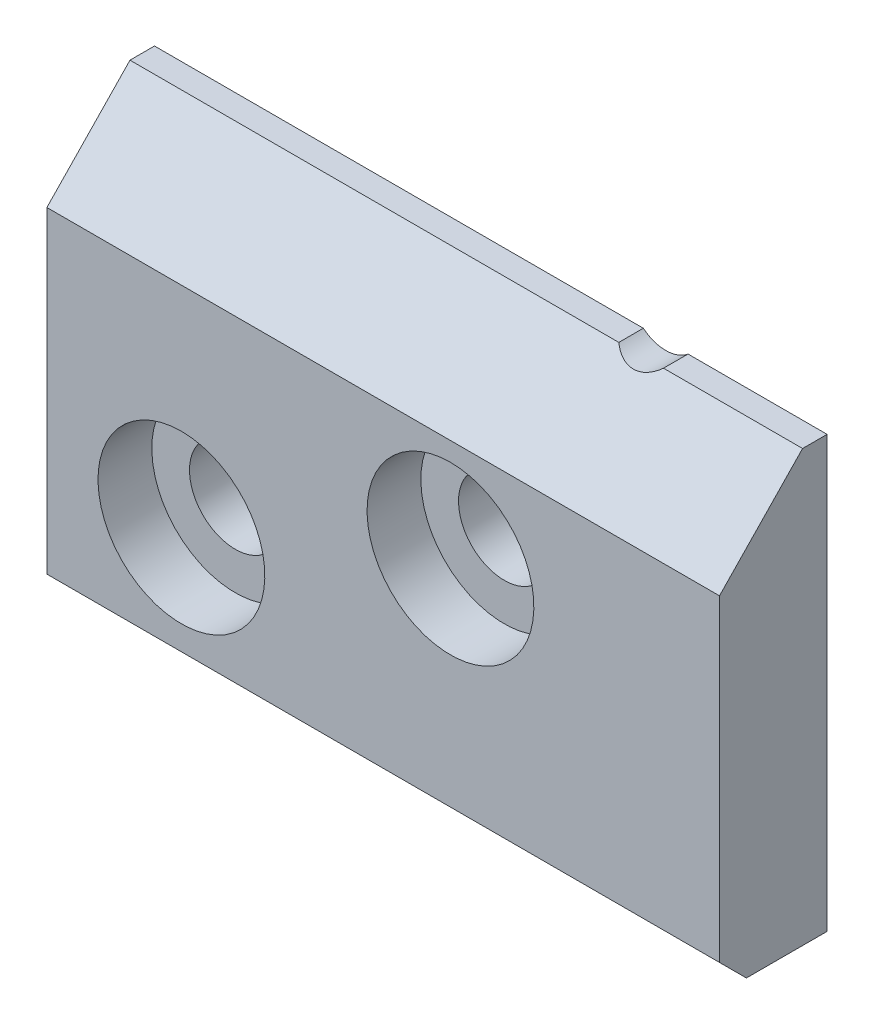
ISO-10303-21;
HEADER;
FILE_DESCRIPTION(('STEP AP214'),'2;1');
FILE_NAME('part.step','',(''),(''),'','','');
FILE_SCHEMA(('AUTOMOTIVE_DESIGN { 1 0 10303 214 1 1 1 1 }'));
ENDSEC;
DATA;
#1=APPLICATION_CONTEXT('core data for automotive mechanical design processes');
#2=APPLICATION_PROTOCOL_DEFINITION('international standard','automotive_design',2000,#1);
#3=PRODUCT_CONTEXT('',#1,'mechanical');
#4=PRODUCT('Part','Part','',(#3));
#5=PRODUCT_RELATED_PRODUCT_CATEGORY('part','',(#4));
#6=PRODUCT_DEFINITION_FORMATION('','',#4);
#7=PRODUCT_DEFINITION_CONTEXT('part definition',#1,'design');
#8=PRODUCT_DEFINITION('design','',#6,#7);
#9=PRODUCT_DEFINITION_SHAPE('','',#8);
#10=(LENGTH_UNIT() NAMED_UNIT(*) SI_UNIT(.MILLI.,.METRE.));
#11=(NAMED_UNIT(*) PLANE_ANGLE_UNIT() SI_UNIT($,.RADIAN.));
#12=(NAMED_UNIT(*) SI_UNIT($,.STERADIAN.) SOLID_ANGLE_UNIT());
#13=UNCERTAINTY_MEASURE_WITH_UNIT(LENGTH_MEASURE(1.E-05),#10,'distance_accuracy_value','');
#14=(GEOMETRIC_REPRESENTATION_CONTEXT(3) GLOBAL_UNCERTAINTY_ASSIGNED_CONTEXT((#13)) GLOBAL_UNIT_ASSIGNED_CONTEXT((#10,
#11,#12)) REPRESENTATION_CONTEXT('',''));
#15=CARTESIAN_POINT('',(0.,0.,0.));
#16=DIRECTION('',(0.,0.,1.));
#17=DIRECTION('',(1.,0.,0.));
#18=AXIS2_PLACEMENT_3D('',#15,#16,#17);
#19=CARTESIAN_POINT('',(55.,-12.,-22.));
#20=DIRECTION('',(0.,0.,-1.));
#21=DIRECTION('',(0.,1.,0.));
#22=AXIS2_PLACEMENT_3D('',#19,#20,#21);
#23=CYLINDRICAL_SURFACE('',#22,3.1);
#24=CARTESIAN_POINT('',(55.,-12.,-26.));
#25=DIRECTION('',(0.,0.,-1.));
#26=DIRECTION('',(0.,1.,0.));
#27=AXIS2_PLACEMENT_3D('',#24,#25,#26);
#28=CIRCLE('',#27,3.1);
#29=CARTESIAN_POINT('',(55.,-8.9,-26.));
#30=VERTEX_POINT('',#29);
#31=EDGE_CURVE('E142',#30,#30,#28,.T.);
#32=ORIENTED_EDGE('',*,*,#31,.T.);
#33=EDGE_LOOP('',(#32));
#34=FACE_BOUND('',#33,.T.);
#35=CARTESIAN_POINT('',(55.,-12.,-24.));
#36=DIRECTION('',(0.,0.,-1.));
#37=DIRECTION('',(0.,1.,0.));
#38=AXIS2_PLACEMENT_3D('',#35,#36,#37);
#39=CIRCLE('',#38,3.1);
#40=CARTESIAN_POINT('',(55.,-8.9,-24.));
#41=VERTEX_POINT('',#40);
#42=EDGE_CURVE('E19',#41,#41,#39,.T.);
#43=ORIENTED_EDGE('',*,*,#42,.F.);
#44=EDGE_LOOP('',(#43));
#45=FACE_BOUND('',#44,.T.);
#46=ADVANCED_FACE('F16',(#34,#45),#23,.F.);
#47=CARTESIAN_POINT('',(45.,-16.,-22.));
#48=DIRECTION('',(0.,0.,-1.));
#49=DIRECTION('',(0.,1.,0.));
#50=AXIS2_PLACEMENT_3D('',#47,#48,#49);
#51=CYLINDRICAL_SURFACE('',#50,3.1);
#52=CARTESIAN_POINT('',(45.,-16.,-26.));
#53=DIRECTION('',(0.,0.,-1.));
#54=DIRECTION('',(0.,1.,0.));
#55=AXIS2_PLACEMENT_3D('',#52,#53,#54);
#56=CIRCLE('',#55,3.1);
#57=CARTESIAN_POINT('',(45.,-12.9,-26.));
#58=VERTEX_POINT('',#57);
#59=EDGE_CURVE('E138',#58,#58,#56,.T.);
#60=ORIENTED_EDGE('',*,*,#59,.T.);
#61=EDGE_LOOP('',(#60));
#62=FACE_BOUND('',#61,.T.);
#63=CARTESIAN_POINT('',(45.,-16.,-24.));
#64=DIRECTION('',(0.,0.,-1.));
#65=DIRECTION('',(0.,1.,0.));
#66=AXIS2_PLACEMENT_3D('',#63,#64,#65);
#67=CIRCLE('',#66,3.1);
#68=CARTESIAN_POINT('',(45.,-12.9,-24.));
#69=VERTEX_POINT('',#68);
#70=EDGE_CURVE('E144',#69,#69,#67,.T.);
#71=ORIENTED_EDGE('',*,*,#70,.F.);
#72=EDGE_LOOP('',(#71));
#73=FACE_BOUND('',#72,.T.);
#74=ADVANCED_FACE('F154',(#62,#73),#51,.F.);
#75=CARTESIAN_POINT('',(38.,-19.,-23.));
#76=DIRECTION('',(0.,-0.707106781186548,0.707106781186548));
#77=DIRECTION('',(0.,-0.707106781186548,-0.707106781186548));
#78=AXIS2_PLACEMENT_3D('',#75,#76,#77);
#79=PLANE('',#78);
#80=DIRECTION('',(1.,0.,0.));
#81=VECTOR('',#80,1.);
#82=CARTESIAN_POINT('',(40.,-21.,-25.));
#83=LINE('',#82,#81);
#84=CARTESIAN_POINT('',(65.,-21.,-25.));
#85=VERTEX_POINT('',#84);
#86=CARTESIAN_POINT('',(40.,-21.,-25.));
#87=VERTEX_POINT('',#86);
#88=EDGE_CURVE('E325',#85,#87,#83,.F.);
#89=ORIENTED_EDGE('',*,*,#88,.F.);
#90=DIRECTION('',(0.,-0.707106781186548,-0.707106781186548));
#91=VECTOR('',#90,1.);
#92=CARTESIAN_POINT('',(65.,-19.,-23.));
#93=LINE('',#92,#91);
#94=CARTESIAN_POINT('',(65.,-20.,-24.));
#95=VERTEX_POINT('',#94);
#96=EDGE_CURVE('E92',#85,#95,#93,.F.);
#97=ORIENTED_EDGE('',*,*,#96,.T.);
#98=DIRECTION('',(1.,0.,0.));
#99=VECTOR('',#98,1.);
#100=CARTESIAN_POINT('',(40.,-20.,-24.));
#101=LINE('',#100,#99);
#102=CARTESIAN_POINT('',(40.,-20.,-24.));
#103=VERTEX_POINT('',#102);
#104=EDGE_CURVE('E85',#103,#95,#101,.T.);
#105=ORIENTED_EDGE('',*,*,#104,.F.);
#106=DIRECTION('',(0.,-0.707106781186547,-0.707106781186547));
#107=VECTOR('',#106,1.);
#108=CARTESIAN_POINT('',(40.,-20.,-24.));
#109=LINE('',#108,#107);
#110=EDGE_CURVE('E89',#103,#87,#109,.T.);
#111=ORIENTED_EDGE('',*,*,#110,.T.);
#112=EDGE_LOOP('',(#89,#97,#105,#111));
#113=FACE_BOUND('',#112,.T.);
#114=ADVANCED_FACE('F88',(#113),#79,.T.);
#115=CARTESIAN_POINT('',(40.,-5.,-24.));
#116=DIRECTION('',(0.,0.,1.));
#117=DIRECTION('',(0.,-1.,0.));
#118=AXIS2_PLACEMENT_3D('',#115,#116,#117);
#119=PLANE('',#118);
#120=ORIENTED_EDGE('',*,*,#70,.T.);
#121=EDGE_LOOP('',(#120));
#122=FACE_BOUND('',#121,.T.);
#123=ORIENTED_EDGE('',*,*,#42,.T.);
#124=EDGE_LOOP('',(#123));
#125=FACE_BOUND('',#124,.T.);
#126=DIRECTION('',(0.,1.,0.));
#127=VECTOR('',#126,1.);
#128=CARTESIAN_POINT('',(40.,-5.,-24.));
#129=LINE('',#128,#127);
#130=CARTESIAN_POINT('',(40.,-8.19778269812869,-23.9999999999997));
#131=VERTEX_POINT('',#130);
#132=EDGE_CURVE('E103',#131,#103,#129,.F.);
#133=ORIENTED_EDGE('',*,*,#132,.T.);
#134=ORIENTED_EDGE('',*,*,#104,.T.);
#135=DIRECTION('',(0.,1.,0.));
#136=VECTOR('',#135,1.);
#137=CARTESIAN_POINT('',(65.,-5.,-24.));
#138=LINE('',#137,#136);
#139=CARTESIAN_POINT('',(65.,-8.19778269812869,-23.9999999999997));
#140=VERTEX_POINT('',#139);
#141=EDGE_CURVE('E313',#140,#95,#138,.F.);
#142=ORIENTED_EDGE('',*,*,#141,.F.);
#143=DIRECTION('',(1.,0.,0.));
#144=VECTOR('',#143,1.);
#145=CARTESIAN_POINT('',(38.,-8.19778269812807,-23.999999999999));
#146=LINE('',#145,#144);
#147=EDGE_CURVE('E109',#140,#131,#146,.F.);
#148=ORIENTED_EDGE('',*,*,#147,.T.);
#149=EDGE_LOOP('',(#133,#134,#142,#148));
#150=FACE_BOUND('',#149,.T.);
#151=ADVANCED_FACE('F108',(#122,#125,#150),#119,.T.);
#152=CARTESIAN_POINT('',(38.,-4.473291852295,-27.59669900169));
#153=DIRECTION('',(0.,-0.694658370458825,-0.719339800338818));
#154=DIRECTION('',(0.,0.719339800338818,-0.694658370458825));
#155=AXIS2_PLACEMENT_3D('',#152,#153,#154);
#156=PLANE('',#155);
#157=ORIENTED_EDGE('',*,*,#147,.F.);
#158=DIRECTION('',(0.,-0.719339800339264,0.694658370458363));
#159=VECTOR('',#158,1.);
#160=CARTESIAN_POINT('',(65.,-5.,-27.08806285585));
#161=LINE('',#160,#159);
#162=CARTESIAN_POINT('',(65.,-5.,-27.08806285585));
#163=VERTEX_POINT('',#162);
#164=EDGE_CURVE('E59',#163,#140,#161,.T.);
#165=ORIENTED_EDGE('',*,*,#164,.F.);
#166=DIRECTION('',(1.,0.,0.));
#167=VECTOR('',#166,1.);
#168=CARTESIAN_POINT('',(40.,-5.,-27.08806285585));
#169=LINE('',#168,#167);
#170=CARTESIAN_POINT('',(59.8306623862912,-4.99999999999995,-27.0880628558511));
#171=VERTEX_POINT('',#170);
#172=EDGE_CURVE('E137',#163,#171,#169,.F.);
#173=ORIENTED_EDGE('',*,*,#172,.T.);
#174=CARTESIAN_POINT('',(59.,-4.,-28.0537516306587));
#175=DIRECTION('',(0.,-0.694658370458825,-0.719339800338818));
#176=DIRECTION('',(0.,0.719339800338818,-0.694658370458825));
#177=AXIS2_PLACEMENT_3D('',#174,#175,#176);
#178=ELLIPSE('',#177,1.80721266832126,1.3);
#179=CARTESIAN_POINT('',(58.1693376137088,-4.99999999999995,-27.0880628558511));
#180=VERTEX_POINT('',#179);
#181=EDGE_CURVE('E50',#171,#180,#178,.T.);
#182=ORIENTED_EDGE('',*,*,#181,.T.);
#183=DIRECTION('',(1.,0.,0.));
#184=VECTOR('',#183,1.);
#185=CARTESIAN_POINT('',(40.,-5.,-27.08806285585));
#186=LINE('',#185,#184);
#187=CARTESIAN_POINT('',(40.,-5.,-27.08806285585));
#188=VERTEX_POINT('',#187);
#189=EDGE_CURVE('E141',#180,#188,#186,.F.);
#190=ORIENTED_EDGE('',*,*,#189,.T.);
#191=DIRECTION('',(0.,-0.719339800339264,0.694658370458363));
#192=VECTOR('',#191,1.);
#193=CARTESIAN_POINT('',(40.,-5.,-27.08806285585));
#194=LINE('',#193,#192);
#195=EDGE_CURVE('E110',#188,#131,#194,.T.);
#196=ORIENTED_EDGE('',*,*,#195,.T.);
#197=EDGE_LOOP('',(#157,#165,#173,#182,#190,#196));
#198=FACE_BOUND('',#197,.T.);
#199=ADVANCED_FACE('F206',(#198),#156,.F.);
#200=CARTESIAN_POINT('',(55.,-12.,-26.));
#201=DIRECTION('',(0.,0.,-1.));
#202=DIRECTION('',(0.,1.,0.));
#203=AXIS2_PLACEMENT_3D('',#200,#201,#202);
#204=PLANE('',#203);
#205=CARTESIAN_POINT('',(55.,-12.,-26.));
#206=DIRECTION('',(0.,0.,-1.));
#207=DIRECTION('',(0.,1.,0.));
#208=AXIS2_PLACEMENT_3D('',#205,#206,#207);
#209=CIRCLE('',#208,1.7);
#210=CARTESIAN_POINT('',(55.,-10.3,-26.));
#211=VERTEX_POINT('',#210);
#212=EDGE_CURVE('E132',#211,#211,#209,.T.);
#213=ORIENTED_EDGE('',*,*,#212,.T.);
#214=EDGE_LOOP('',(#213));
#215=FACE_BOUND('',#214,.T.);
#216=ORIENTED_EDGE('',*,*,#31,.F.);
#217=EDGE_LOOP('',(#216));
#218=FACE_BOUND('',#217,.T.);
#219=ADVANCED_FACE('F202',(#215,#218),#204,.F.);
#220=CARTESIAN_POINT('',(45.,-16.,-26.));
#221=DIRECTION('',(0.,0.,-1.));
#222=DIRECTION('',(0.,1.,0.));
#223=AXIS2_PLACEMENT_3D('',#220,#221,#222);
#224=PLANE('',#223);
#225=CARTESIAN_POINT('',(45.,-16.,-26.));
#226=DIRECTION('',(0.,0.,-1.));
#227=DIRECTION('',(0.,1.,0.));
#228=AXIS2_PLACEMENT_3D('',#225,#226,#227);
#229=CIRCLE('',#228,1.7);
#230=CARTESIAN_POINT('',(45.,-14.3,-26.));
#231=VERTEX_POINT('',#230);
#232=EDGE_CURVE('E128',#231,#231,#229,.T.);
#233=ORIENTED_EDGE('',*,*,#232,.T.);
#234=EDGE_LOOP('',(#233));
#235=FACE_BOUND('',#234,.T.);
#236=ORIENTED_EDGE('',*,*,#59,.F.);
#237=EDGE_LOOP('',(#236));
#238=FACE_BOUND('',#237,.T.);
#239=ADVANCED_FACE('F198',(#235,#238),#224,.F.);
#240=CARTESIAN_POINT('',(40.,-5.,-28.));
#241=DIRECTION('',(0.,-1.,0.));
#242=DIRECTION('',(0.,0.,-1.));
#243=AXIS2_PLACEMENT_3D('',#240,#241,#242);
#244=PLANE('',#243);
#245=DIRECTION('',(0.,0.,-1.));
#246=VECTOR('',#245,1.);
#247=CARTESIAN_POINT('',(58.1693376137081,-4.99999999999991,-20.));
#248=LINE('',#247,#246);
#249=CARTESIAN_POINT('',(58.1693376137081,-4.99999999999995,-28.));
#250=VERTEX_POINT('',#249);
#251=EDGE_CURVE('E136',#180,#250,#248,.T.);
#252=ORIENTED_EDGE('',*,*,#251,.T.);
#253=DIRECTION('',(1.,0.,0.));
#254=VECTOR('',#253,1.);
#255=CARTESIAN_POINT('',(40.,-5.,-28.));
#256=LINE('',#255,#254);
#257=CARTESIAN_POINT('',(40.,-5.,-28.));
#258=VERTEX_POINT('',#257);
#259=EDGE_CURVE('E131',#250,#258,#256,.F.);
#260=ORIENTED_EDGE('',*,*,#259,.T.);
#261=DIRECTION('',(0.,0.,-1.));
#262=VECTOR('',#261,1.);
#263=CARTESIAN_POINT('',(40.,-5.,-28.));
#264=LINE('',#263,#262);
#265=EDGE_CURVE('E112',#258,#188,#264,.F.);
#266=ORIENTED_EDGE('',*,*,#265,.T.);
#267=ORIENTED_EDGE('',*,*,#189,.F.);
#268=EDGE_LOOP('',(#252,#260,#266,#267));
#269=FACE_BOUND('',#268,.T.);
#270=ADVANCED_FACE('F195',(#269),#244,.F.);
#271=CARTESIAN_POINT('',(40.,-5.,-28.));
#272=DIRECTION('',(1.,0.,0.));
#273=DIRECTION('',(0.,0.,-1.));
#274=AXIS2_PLACEMENT_3D('',#271,#272,#273);
#275=PLANE('',#274);
#276=ORIENTED_EDGE('',*,*,#132,.F.);
#277=ORIENTED_EDGE('',*,*,#195,.F.);
#278=ORIENTED_EDGE('',*,*,#265,.F.);
#279=DIRECTION('',(0.,-1.,0.));
#280=VECTOR('',#279,1.);
#281=CARTESIAN_POINT('',(40.,-5.,-28.));
#282=LINE('',#281,#280);
#283=CARTESIAN_POINT('',(40.,-21.,-28.));
#284=VERTEX_POINT('',#283);
#285=EDGE_CURVE('E342',#258,#284,#282,.T.);
#286=ORIENTED_EDGE('',*,*,#285,.T.);
#287=DIRECTION('',(0.,0.,-1.));
#288=VECTOR('',#287,1.);
#289=CARTESIAN_POINT('',(40.,-21.,-28.));
#290=LINE('',#289,#288);
#291=EDGE_CURVE('E106',#87,#284,#290,.T.);
#292=ORIENTED_EDGE('',*,*,#291,.F.);
#293=ORIENTED_EDGE('',*,*,#110,.F.);
#294=EDGE_LOOP('',(#276,#277,#278,#286,#292,#293));
#295=FACE_BOUND('',#294,.T.);
#296=ADVANCED_FACE('F101',(#295),#275,.F.);
#297=CARTESIAN_POINT('',(40.,-21.,-28.));
#298=DIRECTION('',(0.,-1.,0.));
#299=DIRECTION('',(0.,0.,-1.));
#300=AXIS2_PLACEMENT_3D('',#297,#298,#299);
#301=PLANE('',#300);
#302=DIRECTION('',(0.,0.,-1.));
#303=VECTOR('',#302,1.);
#304=CARTESIAN_POINT('',(65.,-21.,-28.));
#305=LINE('',#304,#303);
#306=CARTESIAN_POINT('',(65.,-21.,-28.));
#307=VERTEX_POINT('',#306);
#308=EDGE_CURVE('E316',#85,#307,#305,.T.);
#309=ORIENTED_EDGE('',*,*,#308,.F.);
#310=ORIENTED_EDGE('',*,*,#88,.T.);
#311=ORIENTED_EDGE('',*,*,#291,.T.);
#312=DIRECTION('',(1.,0.,0.));
#313=VECTOR('',#312,1.);
#314=CARTESIAN_POINT('',(40.,-21.,-28.));
#315=LINE('',#314,#313);
#316=EDGE_CURVE('E344',#284,#307,#315,.T.);
#317=ORIENTED_EDGE('',*,*,#316,.T.);
#318=EDGE_LOOP('',(#309,#310,#311,#317));
#319=FACE_BOUND('',#318,.T.);
#320=ADVANCED_FACE('F188',(#319),#301,.T.);
#321=CARTESIAN_POINT('',(65.,-5.,-28.));
#322=DIRECTION('',(1.,0.,0.));
#323=DIRECTION('',(0.,0.,-1.));
#324=AXIS2_PLACEMENT_3D('',#321,#322,#323);
#325=PLANE('',#324);
#326=ORIENTED_EDGE('',*,*,#141,.T.);
#327=ORIENTED_EDGE('',*,*,#96,.F.);
#328=ORIENTED_EDGE('',*,*,#308,.T.);
#329=DIRECTION('',(0.,-1.,0.));
#330=VECTOR('',#329,1.);
#331=CARTESIAN_POINT('',(65.,-5.,-28.));
#332=LINE('',#331,#330);
#333=CARTESIAN_POINT('',(65.,-5.,-28.));
#334=VERTEX_POINT('',#333);
#335=EDGE_CURVE('E373',#307,#334,#332,.F.);
#336=ORIENTED_EDGE('',*,*,#335,.T.);
#337=DIRECTION('',(0.,0.,-1.));
#338=VECTOR('',#337,1.);
#339=CARTESIAN_POINT('',(65.,-5.,-28.));
#340=LINE('',#339,#338);
#341=EDGE_CURVE('E315',#334,#163,#340,.F.);
#342=ORIENTED_EDGE('',*,*,#341,.T.);
#343=ORIENTED_EDGE('',*,*,#164,.T.);
#344=EDGE_LOOP('',(#326,#327,#328,#336,#342,#343));
#345=FACE_BOUND('',#344,.T.);
#346=ADVANCED_FACE('F184',(#345),#325,.T.);
#347=CARTESIAN_POINT('',(40.,-5.,-28.));
#348=DIRECTION('',(0.,-1.,0.));
#349=DIRECTION('',(0.,0.,-1.));
#350=AXIS2_PLACEMENT_3D('',#347,#348,#349);
#351=PLANE('',#350);
#352=ORIENTED_EDGE('',*,*,#341,.F.);
#353=DIRECTION('',(1.,0.,0.));
#354=VECTOR('',#353,1.);
#355=CARTESIAN_POINT('',(40.,-5.,-28.));
#356=LINE('',#355,#354);
#357=CARTESIAN_POINT('',(59.8306623862919,-4.99999999999995,-28.));
#358=VERTEX_POINT('',#357);
#359=EDGE_CURVE('E127',#334,#358,#356,.F.);
#360=ORIENTED_EDGE('',*,*,#359,.T.);
#361=DIRECTION('',(0.,0.,-1.));
#362=VECTOR('',#361,1.);
#363=CARTESIAN_POINT('',(59.8306623862919,-4.99999999999991,-20.));
#364=LINE('',#363,#362);
#365=EDGE_CURVE('E34',#358,#171,#364,.F.);
#366=ORIENTED_EDGE('',*,*,#365,.T.);
#367=ORIENTED_EDGE('',*,*,#172,.F.);
#368=EDGE_LOOP('',(#352,#360,#366,#367));
#369=FACE_BOUND('',#368,.T.);
#370=ADVANCED_FACE('F181',(#369),#351,.F.);
#371=CARTESIAN_POINT('',(59.,-4.,-20.));
#372=DIRECTION('',(0.,0.,-1.));
#373=DIRECTION('',(0.,1.,0.));
#374=AXIS2_PLACEMENT_3D('',#371,#372,#373);
#375=CYLINDRICAL_SURFACE('',#374,1.3);
#376=CARTESIAN_POINT('',(59.,-4.,-28.));
#377=DIRECTION('',(0.,0.,-1.));
#378=DIRECTION('',(0.,1.,0.));
#379=AXIS2_PLACEMENT_3D('',#376,#377,#378);
#380=CIRCLE('',#379,1.3);
#381=EDGE_CURVE('E125',#358,#250,#380,.T.);
#382=ORIENTED_EDGE('',*,*,#381,.T.);
#383=ORIENTED_EDGE('',*,*,#251,.F.);
#384=ORIENTED_EDGE('',*,*,#181,.F.);
#385=ORIENTED_EDGE('',*,*,#365,.F.);
#386=EDGE_LOOP('',(#382,#383,#384,#385));
#387=FACE_BOUND('',#386,.T.);
#388=ADVANCED_FACE('F177',(#387),#375,.F.);
#389=CARTESIAN_POINT('',(55.,-12.,-20.));
#390=DIRECTION('',(0.,0.,-1.));
#391=DIRECTION('',(0.,1.,0.));
#392=AXIS2_PLACEMENT_3D('',#389,#390,#391);
#393=CYLINDRICAL_SURFACE('',#392,1.7);
#394=CARTESIAN_POINT('',(55.,-12.,-28.));
#395=DIRECTION('',(0.,0.,-1.));
#396=DIRECTION('',(0.,1.,0.));
#397=AXIS2_PLACEMENT_3D('',#394,#395,#396);
#398=CIRCLE('',#397,1.7);
#399=CARTESIAN_POINT('',(55.,-10.3,-28.));
#400=VERTEX_POINT('',#399);
#401=EDGE_CURVE('E25',#400,#400,#398,.T.);
#402=ORIENTED_EDGE('',*,*,#401,.T.);
#403=EDGE_LOOP('',(#402));
#404=FACE_BOUND('',#403,.T.);
#405=ORIENTED_EDGE('',*,*,#212,.F.);
#406=EDGE_LOOP('',(#405));
#407=FACE_BOUND('',#406,.T.);
#408=ADVANCED_FACE('F169',(#404,#407),#393,.F.);
#409=CARTESIAN_POINT('',(45.,-16.,-20.));
#410=DIRECTION('',(0.,0.,-1.));
#411=DIRECTION('',(0.,1.,0.));
#412=AXIS2_PLACEMENT_3D('',#409,#410,#411);
#413=CYLINDRICAL_SURFACE('',#412,1.7);
#414=CARTESIAN_POINT('',(45.,-16.,-28.));
#415=DIRECTION('',(0.,0.,-1.));
#416=DIRECTION('',(0.,1.,0.));
#417=AXIS2_PLACEMENT_3D('',#414,#415,#416);
#418=CIRCLE('',#417,1.7);
#419=CARTESIAN_POINT('',(45.,-14.3,-28.));
#420=VERTEX_POINT('',#419);
#421=EDGE_CURVE('E10',#420,#420,#418,.T.);
#422=ORIENTED_EDGE('',*,*,#421,.T.);
#423=EDGE_LOOP('',(#422));
#424=FACE_BOUND('',#423,.T.);
#425=ORIENTED_EDGE('',*,*,#232,.F.);
#426=EDGE_LOOP('',(#425));
#427=FACE_BOUND('',#426,.T.);
#428=ADVANCED_FACE('F163',(#424,#427),#413,.F.);
#429=CARTESIAN_POINT('',(40.,-5.,-28.));
#430=DIRECTION('',(0.,0.,1.));
#431=DIRECTION('',(0.,-1.,0.));
#432=AXIS2_PLACEMENT_3D('',#429,#430,#431);
#433=PLANE('',#432);
#434=ORIENTED_EDGE('',*,*,#421,.F.);
#435=EDGE_LOOP('',(#434));
#436=FACE_BOUND('',#435,.T.);
#437=ORIENTED_EDGE('',*,*,#401,.F.);
#438=EDGE_LOOP('',(#437));
#439=FACE_BOUND('',#438,.T.);
#440=ORIENTED_EDGE('',*,*,#359,.F.);
#441=ORIENTED_EDGE('',*,*,#335,.F.);
#442=ORIENTED_EDGE('',*,*,#316,.F.);
#443=ORIENTED_EDGE('',*,*,#285,.F.);
#444=ORIENTED_EDGE('',*,*,#259,.F.);
#445=ORIENTED_EDGE('',*,*,#381,.F.);
#446=EDGE_LOOP('',(#440,#441,#442,#443,#444,#445));
#447=FACE_BOUND('',#446,.T.);
#448=ADVANCED_FACE('F161',(#436,#439,#447),#433,.F.);
#449=CLOSED_SHELL('',(#46,#74,#114,#151,#199,#219,#239,#270,#296,#320,#346,#370,#388,#408,#428,#448));
#450=MANIFOLD_SOLID_BREP('B1',#449);
#451=ADVANCED_BREP_SHAPE_REPRESENTATION('',(#18,#450),#14);
#452=SHAPE_DEFINITION_REPRESENTATION(#9,#451);
ENDSEC;
END-ISO-10303-21;
